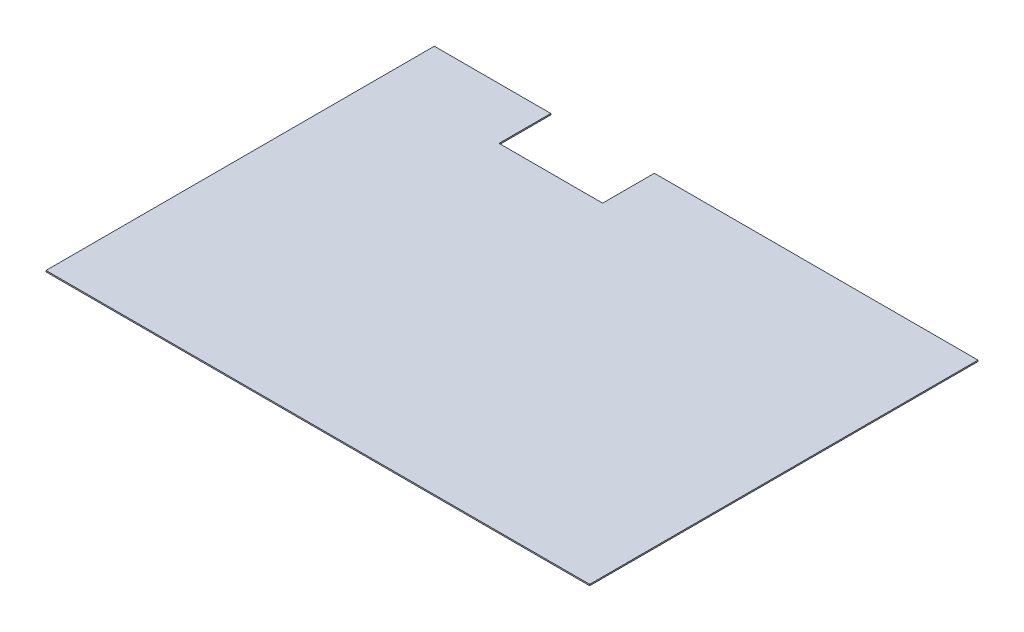
ISO-10303-21;
HEADER;
FILE_DESCRIPTION(('STEP AP214'),'2;1');
FILE_NAME('part.step','',(''),(''),'','','');
FILE_SCHEMA(('AUTOMOTIVE_DESIGN { 1 0 10303 214 1 1 1 1 }'));
ENDSEC;
DATA;
#1=APPLICATION_CONTEXT('core data for automotive mechanical design processes');
#2=APPLICATION_PROTOCOL_DEFINITION('international standard','automotive_design',2000,#1);
#3=PRODUCT_CONTEXT('',#1,'mechanical');
#4=PRODUCT('Part','Part','',(#3));
#5=PRODUCT_RELATED_PRODUCT_CATEGORY('part','',(#4));
#6=PRODUCT_DEFINITION_FORMATION('','',#4);
#7=PRODUCT_DEFINITION_CONTEXT('part definition',#1,'design');
#8=PRODUCT_DEFINITION('design','',#6,#7);
#9=PRODUCT_DEFINITION_SHAPE('','',#8);
#10=(LENGTH_UNIT() NAMED_UNIT(*) SI_UNIT(.MILLI.,.METRE.));
#11=(NAMED_UNIT(*) PLANE_ANGLE_UNIT() SI_UNIT($,.RADIAN.));
#12=(NAMED_UNIT(*) SI_UNIT($,.STERADIAN.) SOLID_ANGLE_UNIT());
#13=UNCERTAINTY_MEASURE_WITH_UNIT(LENGTH_MEASURE(1.E-05),#10,'distance_accuracy_value','');
#14=(GEOMETRIC_REPRESENTATION_CONTEXT(3) GLOBAL_UNCERTAINTY_ASSIGNED_CONTEXT((#13)) GLOBAL_UNIT_ASSIGNED_CONTEXT((#10,
#11,#12)) REPRESENTATION_CONTEXT('',''));
#15=CARTESIAN_POINT('',(0.,0.,0.));
#16=DIRECTION('',(0.,0.,1.));
#17=DIRECTION('',(1.,0.,0.));
#18=AXIS2_PLACEMENT_3D('',#15,#16,#17);
#19=CARTESIAN_POINT('',(533.4,2.54,-381.));
#20=DIRECTION('',(0.,0.,1.));
#21=DIRECTION('',(1.,0.,0.));
#22=AXIS2_PLACEMENT_3D('',#19,#20,#21);
#23=PLANE('',#22);
#24=DIRECTION('',(0.,1.,0.));
#25=VECTOR('',#24,1.);
#26=CARTESIAN_POINT('',(-101.6,0.,-381.));
#27=LINE('',#26,#25);
#28=CARTESIAN_POINT('',(-101.6,0.,-381.));
#29=VERTEX_POINT('',#28);
#30=CARTESIAN_POINT('',(-101.6,2.54,-381.));
#31=VERTEX_POINT('',#30);
#32=EDGE_CURVE('E137',#29,#31,#27,.T.);
#33=ORIENTED_EDGE('',*,*,#32,.T.);
#34=DIRECTION('',(-1.,0.,0.));
#35=VECTOR('',#34,1.);
#36=CARTESIAN_POINT('',(533.4,2.54,-381.));
#37=LINE('',#36,#35);
#38=CARTESIAN_POINT('',(533.4,2.54,-381.));
#39=VERTEX_POINT('',#38);
#40=EDGE_CURVE('E149',#39,#31,#37,.T.);
#41=ORIENTED_EDGE('',*,*,#40,.F.);
#42=DIRECTION('',(0.,-1.,0.));
#43=VECTOR('',#42,1.);
#44=CARTESIAN_POINT('',(533.4,2.54,-381.));
#45=LINE('',#44,#43);
#46=CARTESIAN_POINT('',(533.4,0.,-381.));
#47=VERTEX_POINT('',#46);
#48=EDGE_CURVE('E11',#39,#47,#45,.T.);
#49=ORIENTED_EDGE('',*,*,#48,.T.);
#50=DIRECTION('',(-1.,0.,0.));
#51=VECTOR('',#50,1.);
#52=CARTESIAN_POINT('',(533.4,0.,-381.));
#53=LINE('',#52,#51);
#54=EDGE_CURVE('E144',#47,#29,#53,.T.);
#55=ORIENTED_EDGE('',*,*,#54,.T.);
#56=EDGE_LOOP('',(#33,#41,#49,#55));
#57=FACE_BOUND('',#56,.T.);
#58=ADVANCED_FACE('F32',(#57),#23,.F.);
#59=CARTESIAN_POINT('',(533.4,2.54,-381.));
#60=DIRECTION('',(1.,0.,0.));
#61=DIRECTION('',(0.,0.,-1.));
#62=AXIS2_PLACEMENT_3D('',#59,#60,#61);
#63=PLANE('',#62);
#64=DIRECTION('',(0.,0.,1.));
#65=VECTOR('',#64,1.);
#66=CARTESIAN_POINT('',(533.4,0.,-381.));
#67=LINE('',#66,#65);
#68=CARTESIAN_POINT('',(533.4,0.,381.));
#69=VERTEX_POINT('',#68);
#70=EDGE_CURVE('E136',#47,#69,#67,.T.);
#71=ORIENTED_EDGE('',*,*,#70,.F.);
#72=ORIENTED_EDGE('',*,*,#48,.F.);
#73=DIRECTION('',(0.,0.,1.));
#74=VECTOR('',#73,1.);
#75=CARTESIAN_POINT('',(533.4,2.54,-381.));
#76=LINE('',#75,#74);
#77=CARTESIAN_POINT('',(533.4,2.54,381.));
#78=VERTEX_POINT('',#77);
#79=EDGE_CURVE('E141',#39,#78,#76,.T.);
#80=ORIENTED_EDGE('',*,*,#79,.T.);
#81=DIRECTION('',(0.,-1.,0.));
#82=VECTOR('',#81,1.);
#83=CARTESIAN_POINT('',(533.4,2.54,381.));
#84=LINE('',#83,#82);
#85=EDGE_CURVE('E36',#78,#69,#84,.T.);
#86=ORIENTED_EDGE('',*,*,#85,.T.);
#87=EDGE_LOOP('',(#71,#72,#80,#86));
#88=FACE_BOUND('',#87,.T.);
#89=ADVANCED_FACE('F34',(#88),#63,.T.);
#90=CARTESIAN_POINT('',(-304.8,2.54,-381.));
#91=VERTEX_POINT('',#90);
#92=CARTESIAN_POINT('',(-533.4,2.54,-381.));
#93=VERTEX_POINT('',#92);
#94=EDGE_CURVE('E148',#91,#93,#37,.T.);
#95=ORIENTED_EDGE('',*,*,#94,.F.);
#96=DIRECTION('',(0.,1.,0.));
#97=VECTOR('',#96,1.);
#98=CARTESIAN_POINT('',(-304.8,0.,-381.));
#99=LINE('',#98,#97);
#100=CARTESIAN_POINT('',(-304.8,0.,-381.));
#101=VERTEX_POINT('',#100);
#102=EDGE_CURVE('E134',#101,#91,#99,.T.);
#103=ORIENTED_EDGE('',*,*,#102,.F.);
#104=CARTESIAN_POINT('',(-533.4,0.,-381.));
#105=VERTEX_POINT('',#104);
#106=EDGE_CURVE('E124',#101,#105,#53,.T.);
#107=ORIENTED_EDGE('',*,*,#106,.T.);
#108=DIRECTION('',(0.,-1.,0.));
#109=VECTOR('',#108,1.);
#110=CARTESIAN_POINT('',(-533.4,2.54,-381.));
#111=LINE('',#110,#109);
#112=EDGE_CURVE('E41',#93,#105,#111,.T.);
#113=ORIENTED_EDGE('',*,*,#112,.F.);
#114=EDGE_LOOP('',(#95,#103,#107,#113));
#115=FACE_BOUND('',#114,.T.);
#116=ADVANCED_FACE('F175',(#115),#23,.F.);
#117=CARTESIAN_POINT('',(-533.4,2.54,-381.));
#118=DIRECTION('',(1.,0.,0.));
#119=DIRECTION('',(0.,0.,-1.));
#120=AXIS2_PLACEMENT_3D('',#117,#118,#119);
#121=PLANE('',#120);
#122=DIRECTION('',(0.,0.,1.));
#123=VECTOR('',#122,1.);
#124=CARTESIAN_POINT('',(-533.4,0.,-381.));
#125=LINE('',#124,#123);
#126=CARTESIAN_POINT('',(-533.4,0.,381.));
#127=VERTEX_POINT('',#126);
#128=EDGE_CURVE('E157',#105,#127,#125,.T.);
#129=ORIENTED_EDGE('',*,*,#128,.T.);
#130=DIRECTION('',(0.,-1.,0.));
#131=VECTOR('',#130,1.);
#132=CARTESIAN_POINT('',(-533.4,2.54,381.));
#133=LINE('',#132,#131);
#134=CARTESIAN_POINT('',(-533.4,2.54,381.));
#135=VERTEX_POINT('',#134);
#136=EDGE_CURVE('E162',#135,#127,#133,.T.);
#137=ORIENTED_EDGE('',*,*,#136,.F.);
#138=DIRECTION('',(0.,0.,1.));
#139=VECTOR('',#138,1.);
#140=CARTESIAN_POINT('',(-533.4,2.54,-381.));
#141=LINE('',#140,#139);
#142=EDGE_CURVE('E146',#93,#135,#141,.T.);
#143=ORIENTED_EDGE('',*,*,#142,.F.);
#144=ORIENTED_EDGE('',*,*,#112,.T.);
#145=EDGE_LOOP('',(#129,#137,#143,#144));
#146=FACE_BOUND('',#145,.T.);
#147=ADVANCED_FACE('F173',(#146),#121,.F.);
#148=CARTESIAN_POINT('',(533.4,2.54,381.));
#149=DIRECTION('',(0.,0.,1.));
#150=DIRECTION('',(1.,0.,0.));
#151=AXIS2_PLACEMENT_3D('',#148,#149,#150);
#152=PLANE('',#151);
#153=DIRECTION('',(-1.,0.,0.));
#154=VECTOR('',#153,1.);
#155=CARTESIAN_POINT('',(533.4,0.,381.));
#156=LINE('',#155,#154);
#157=EDGE_CURVE('E154',#69,#127,#156,.T.);
#158=ORIENTED_EDGE('',*,*,#157,.F.);
#159=ORIENTED_EDGE('',*,*,#85,.F.);
#160=DIRECTION('',(-1.,0.,0.));
#161=VECTOR('',#160,1.);
#162=CARTESIAN_POINT('',(533.4,2.54,381.));
#163=LINE('',#162,#161);
#164=EDGE_CURVE('E143',#78,#135,#163,.T.);
#165=ORIENTED_EDGE('',*,*,#164,.T.);
#166=ORIENTED_EDGE('',*,*,#136,.T.);
#167=EDGE_LOOP('',(#158,#159,#165,#166));
#168=FACE_BOUND('',#167,.T.);
#169=ADVANCED_FACE('F165',(#168),#152,.T.);
#170=CARTESIAN_POINT('',(0.,2.54,0.));
#171=DIRECTION('',(0.,-1.,0.));
#172=DIRECTION('',(0.,0.,-1.));
#173=AXIS2_PLACEMENT_3D('',#170,#171,#172);
#174=PLANE('',#173);
#175=DIRECTION('',(1.,0.,0.));
#176=VECTOR('',#175,1.);
#177=CARTESIAN_POINT('',(-304.8,2.54,-279.4));
#178=LINE('',#177,#176);
#179=CARTESIAN_POINT('',(-304.8,2.54,-279.4));
#180=VERTEX_POINT('',#179);
#181=CARTESIAN_POINT('',(-101.6,2.54,-279.4));
#182=VERTEX_POINT('',#181);
#183=EDGE_CURVE('E128',#180,#182,#178,.T.);
#184=ORIENTED_EDGE('',*,*,#183,.F.);
#185=DIRECTION('',(0.,0.,1.));
#186=VECTOR('',#185,1.);
#187=CARTESIAN_POINT('',(-304.8,2.54,-381.));
#188=LINE('',#187,#186);
#189=EDGE_CURVE('E111',#91,#180,#188,.T.);
#190=ORIENTED_EDGE('',*,*,#189,.F.);
#191=ORIENTED_EDGE('',*,*,#94,.T.);
#192=ORIENTED_EDGE('',*,*,#142,.T.);
#193=ORIENTED_EDGE('',*,*,#164,.F.);
#194=ORIENTED_EDGE('',*,*,#79,.F.);
#195=ORIENTED_EDGE('',*,*,#40,.T.);
#196=DIRECTION('',(0.,0.,1.));
#197=VECTOR('',#196,1.);
#198=CARTESIAN_POINT('',(-101.6,2.54,-381.));
#199=LINE('',#198,#197);
#200=EDGE_CURVE('E125',#31,#182,#199,.T.);
#201=ORIENTED_EDGE('',*,*,#200,.T.);
#202=EDGE_LOOP('',(#184,#190,#191,#192,#193,#194,#195,#201));
#203=FACE_BOUND('',#202,.T.);
#204=ADVANCED_FACE('F168',(#203),#174,.F.);
#205=CARTESIAN_POINT('',(0.,0.,0.));
#206=DIRECTION('',(0.,-1.,0.));
#207=DIRECTION('',(0.,0.,-1.));
#208=AXIS2_PLACEMENT_3D('',#205,#206,#207);
#209=PLANE('',#208);
#210=DIRECTION('',(0.,0.,1.));
#211=VECTOR('',#210,1.);
#212=CARTESIAN_POINT('',(-304.8,0.,-381.));
#213=LINE('',#212,#211);
#214=CARTESIAN_POINT('',(-304.8,0.,-279.4));
#215=VERTEX_POINT('',#214);
#216=EDGE_CURVE('E108',#101,#215,#213,.T.);
#217=ORIENTED_EDGE('',*,*,#216,.T.);
#218=DIRECTION('',(1.,0.,0.));
#219=VECTOR('',#218,1.);
#220=CARTESIAN_POINT('',(-304.8,0.,-279.4));
#221=LINE('',#220,#219);
#222=CARTESIAN_POINT('',(-101.6,0.,-279.4));
#223=VERTEX_POINT('',#222);
#224=EDGE_CURVE('E116',#215,#223,#221,.T.);
#225=ORIENTED_EDGE('',*,*,#224,.T.);
#226=DIRECTION('',(0.,0.,1.));
#227=VECTOR('',#226,1.);
#228=CARTESIAN_POINT('',(-101.6,0.,-381.));
#229=LINE('',#228,#227);
#230=EDGE_CURVE('E113',#29,#223,#229,.T.);
#231=ORIENTED_EDGE('',*,*,#230,.F.);
#232=ORIENTED_EDGE('',*,*,#54,.F.);
#233=ORIENTED_EDGE('',*,*,#70,.T.);
#234=ORIENTED_EDGE('',*,*,#157,.T.);
#235=ORIENTED_EDGE('',*,*,#128,.F.);
#236=ORIENTED_EDGE('',*,*,#106,.F.);
#237=EDGE_LOOP('',(#217,#225,#231,#232,#233,#234,#235,#236));
#238=FACE_BOUND('',#237,.T.);
#239=ADVANCED_FACE('F122',(#238),#209,.T.);
#240=CARTESIAN_POINT('',(-304.8,0.,-381.));
#241=DIRECTION('',(-1.,0.,0.));
#242=DIRECTION('',(0.,0.,1.));
#243=AXIS2_PLACEMENT_3D('',#240,#241,#242);
#244=PLANE('',#243);
#245=ORIENTED_EDGE('',*,*,#189,.T.);
#246=DIRECTION('',(0.,1.,0.));
#247=VECTOR('',#246,1.);
#248=CARTESIAN_POINT('',(-304.8,0.,-279.4));
#249=LINE('',#248,#247);
#250=EDGE_CURVE('E105',#215,#180,#249,.T.);
#251=ORIENTED_EDGE('',*,*,#250,.F.);
#252=ORIENTED_EDGE('',*,*,#216,.F.);
#253=ORIENTED_EDGE('',*,*,#102,.T.);
#254=EDGE_LOOP('',(#245,#251,#252,#253));
#255=FACE_BOUND('',#254,.T.);
#256=ADVANCED_FACE('F106',(#255),#244,.F.);
#257=CARTESIAN_POINT('',(-101.6,0.,-381.));
#258=DIRECTION('',(-1.,0.,0.));
#259=DIRECTION('',(0.,0.,1.));
#260=AXIS2_PLACEMENT_3D('',#257,#258,#259);
#261=PLANE('',#260);
#262=ORIENTED_EDGE('',*,*,#200,.F.);
#263=ORIENTED_EDGE('',*,*,#32,.F.);
#264=ORIENTED_EDGE('',*,*,#230,.T.);
#265=DIRECTION('',(0.,1.,0.));
#266=VECTOR('',#265,1.);
#267=CARTESIAN_POINT('',(-101.6,0.,-279.4));
#268=LINE('',#267,#266);
#269=EDGE_CURVE('E49',#223,#182,#268,.T.);
#270=ORIENTED_EDGE('',*,*,#269,.T.);
#271=EDGE_LOOP('',(#262,#263,#264,#270));
#272=FACE_BOUND('',#271,.T.);
#273=ADVANCED_FACE('F224',(#272),#261,.T.);
#274=CARTESIAN_POINT('',(-304.8,0.,-279.4));
#275=DIRECTION('',(0.,0.,1.));
#276=DIRECTION('',(1.,0.,0.));
#277=AXIS2_PLACEMENT_3D('',#274,#275,#276);
#278=PLANE('',#277);
#279=ORIENTED_EDGE('',*,*,#183,.T.);
#280=ORIENTED_EDGE('',*,*,#269,.F.);
#281=ORIENTED_EDGE('',*,*,#224,.F.);
#282=ORIENTED_EDGE('',*,*,#250,.T.);
#283=EDGE_LOOP('',(#279,#280,#281,#282));
#284=FACE_BOUND('',#283,.T.);
#285=ADVANCED_FACE('F117',(#284),#278,.F.);
#286=CLOSED_SHELL('',(#58,#89,#116,#147,#169,#204,#239,#256,#273,#285));
#287=MANIFOLD_SOLID_BREP('B2',#286);
#288=ADVANCED_BREP_SHAPE_REPRESENTATION('',(#18,#287),#14);
#289=SHAPE_DEFINITION_REPRESENTATION(#9,#288);
ENDSEC;
END-ISO-10303-21;
